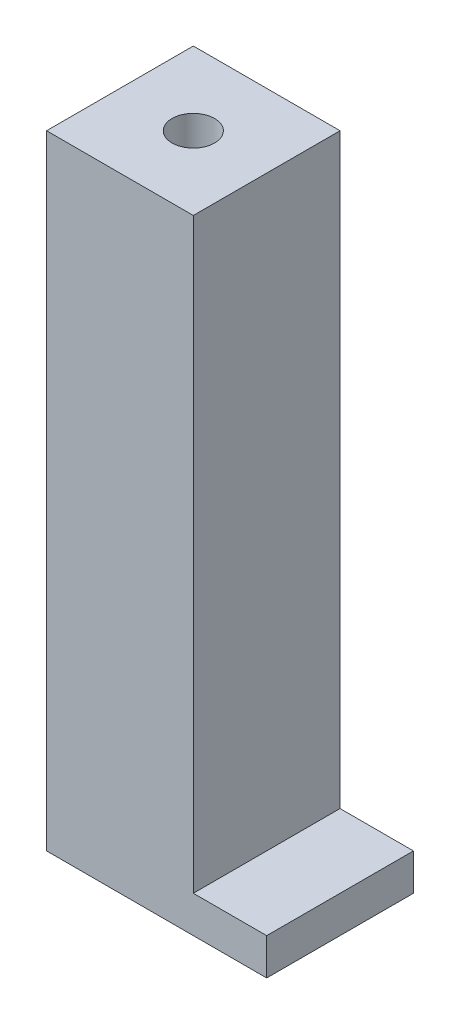
ISO-10303-21;
HEADER;
FILE_DESCRIPTION(('STEP AP214'),'2;1');
FILE_NAME('part.step','',(''),(''),'','','');
FILE_SCHEMA(('AUTOMOTIVE_DESIGN { 1 0 10303 214 1 1 1 1 }'));
ENDSEC;
DATA;
#1=APPLICATION_CONTEXT('core data for automotive mechanical design processes');
#2=APPLICATION_PROTOCOL_DEFINITION('international standard','automotive_design',2000,#1);
#3=PRODUCT_CONTEXT('',#1,'mechanical');
#4=PRODUCT('Part','Part','',(#3));
#5=PRODUCT_RELATED_PRODUCT_CATEGORY('part','',(#4));
#6=PRODUCT_DEFINITION_FORMATION('','',#4);
#7=PRODUCT_DEFINITION_CONTEXT('part definition',#1,'design');
#8=PRODUCT_DEFINITION('design','',#6,#7);
#9=PRODUCT_DEFINITION_SHAPE('','',#8);
#10=(LENGTH_UNIT() NAMED_UNIT(*) SI_UNIT(.MILLI.,.METRE.));
#11=(NAMED_UNIT(*) PLANE_ANGLE_UNIT() SI_UNIT($,.RADIAN.));
#12=(NAMED_UNIT(*) SI_UNIT($,.STERADIAN.) SOLID_ANGLE_UNIT());
#13=UNCERTAINTY_MEASURE_WITH_UNIT(LENGTH_MEASURE(1.E-05),#10,'distance_accuracy_value','');
#14=(GEOMETRIC_REPRESENTATION_CONTEXT(3) GLOBAL_UNCERTAINTY_ASSIGNED_CONTEXT((#13)) GLOBAL_UNIT_ASSIGNED_CONTEXT((#10,
#11,#12)) REPRESENTATION_CONTEXT('',''));
#15=CARTESIAN_POINT('',(0.,0.,0.));
#16=DIRECTION('',(0.,0.,1.));
#17=DIRECTION('',(1.,0.,0.));
#18=AXIS2_PLACEMENT_3D('',#15,#16,#17);
#19=CARTESIAN_POINT('',(10.,80.,-10.));
#20=DIRECTION('',(-1.,0.,0.));
#21=DIRECTION('',(0.,0.,1.));
#22=AXIS2_PLACEMENT_3D('',#19,#20,#21);
#23=PLANE('',#22);
#24=DIRECTION('',(0.,0.,-1.));
#25=VECTOR('',#24,1.);
#26=CARTESIAN_POINT('',(10.,0.,-10.));
#27=LINE('',#26,#25);
#28=CARTESIAN_POINT('',(10.,0.,10.));
#29=VERTEX_POINT('',#28);
#30=CARTESIAN_POINT('',(10.,0.,-10.));
#31=VERTEX_POINT('',#30);
#32=EDGE_CURVE('E139',#29,#31,#27,.T.);
#33=ORIENTED_EDGE('',*,*,#32,.T.);
#34=DIRECTION('',(0.,-1.,0.));
#35=VECTOR('',#34,1.);
#36=CARTESIAN_POINT('',(10.,80.,-10.));
#37=LINE('',#36,#35);
#38=CARTESIAN_POINT('',(10.,80.,-10.));
#39=VERTEX_POINT('',#38);
#40=EDGE_CURVE('E11',#39,#31,#37,.T.);
#41=ORIENTED_EDGE('',*,*,#40,.F.);
#42=DIRECTION('',(0.,0.,-1.));
#43=VECTOR('',#42,1.);
#44=CARTESIAN_POINT('',(10.,80.,-10.));
#45=LINE('',#44,#43);
#46=CARTESIAN_POINT('',(10.,80.,10.));
#47=VERTEX_POINT('',#46);
#48=EDGE_CURVE('E140',#47,#39,#45,.T.);
#49=ORIENTED_EDGE('',*,*,#48,.F.);
#50=DIRECTION('',(0.,-1.,0.));
#51=VECTOR('',#50,1.);
#52=CARTESIAN_POINT('',(10.,80.,10.));
#53=LINE('',#52,#51);
#54=EDGE_CURVE('E150',#47,#29,#53,.T.);
#55=ORIENTED_EDGE('',*,*,#54,.T.);
#56=EDGE_LOOP('',(#33,#41,#49,#55));
#57=FACE_BOUND('',#56,.T.);
#58=ADVANCED_FACE('F39',(#57),#23,.F.);
#59=CARTESIAN_POINT('',(-10.,80.,-10.));
#60=DIRECTION('',(0.,0.,1.));
#61=DIRECTION('',(1.,0.,0.));
#62=AXIS2_PLACEMENT_3D('',#59,#60,#61);
#63=PLANE('',#62);
#64=ORIENTED_EDGE('',*,*,#40,.T.);
#65=DIRECTION('',(1.,0.,0.));
#66=VECTOR('',#65,1.);
#67=CARTESIAN_POINT('',(-10.,0.,-10.));
#68=LINE('',#67,#66);
#69=CARTESIAN_POINT('',(20.,0.,-10.));
#70=VERTEX_POINT('',#69);
#71=EDGE_CURVE('E128',#31,#70,#68,.T.);
#72=ORIENTED_EDGE('',*,*,#71,.T.);
#73=DIRECTION('',(0.,1.,0.));
#74=VECTOR('',#73,1.);
#75=CARTESIAN_POINT('',(20.,-5.,-10.));
#76=LINE('',#75,#74);
#77=CARTESIAN_POINT('',(20.,-5.,-10.));
#78=VERTEX_POINT('',#77);
#79=EDGE_CURVE('E102',#78,#70,#76,.T.);
#80=ORIENTED_EDGE('',*,*,#79,.F.);
#81=DIRECTION('',(1.,0.,0.));
#82=VECTOR('',#81,1.);
#83=CARTESIAN_POINT('',(-10.,-5.,-10.));
#84=LINE('',#83,#82);
#85=CARTESIAN_POINT('',(-10.,-5.,-10.));
#86=VERTEX_POINT('',#85);
#87=EDGE_CURVE('E99',#86,#78,#84,.T.);
#88=ORIENTED_EDGE('',*,*,#87,.F.);
#89=DIRECTION('',(0.,-1.,0.));
#90=VECTOR('',#89,1.);
#91=CARTESIAN_POINT('',(-10.,80.,-10.));
#92=LINE('',#91,#90);
#93=CARTESIAN_POINT('',(-10.,80.,-10.));
#94=VERTEX_POINT('',#93);
#95=EDGE_CURVE('E48',#94,#86,#92,.T.);
#96=ORIENTED_EDGE('',*,*,#95,.F.);
#97=DIRECTION('',(-1.,0.,0.));
#98=VECTOR('',#97,1.);
#99=CARTESIAN_POINT('',(-10.,80.,-10.));
#100=LINE('',#99,#98);
#101=EDGE_CURVE('E143',#39,#94,#100,.T.);
#102=ORIENTED_EDGE('',*,*,#101,.F.);
#103=EDGE_LOOP('',(#64,#72,#80,#88,#96,#102));
#104=FACE_BOUND('',#103,.T.);
#105=ADVANCED_FACE('F100',(#104),#63,.F.);
#106=CARTESIAN_POINT('',(-10.,80.,-10.));
#107=DIRECTION('',(1.,0.,0.));
#108=DIRECTION('',(0.,0.,-1.));
#109=AXIS2_PLACEMENT_3D('',#106,#107,#108);
#110=PLANE('',#109);
#111=ORIENTED_EDGE('',*,*,#95,.T.);
#112=DIRECTION('',(0.,0.,-1.));
#113=VECTOR('',#112,1.);
#114=CARTESIAN_POINT('',(-10.,-5.,10.));
#115=LINE('',#114,#113);
#116=CARTESIAN_POINT('',(-10.,-5.,10.));
#117=VERTEX_POINT('',#116);
#118=EDGE_CURVE('E93',#117,#86,#115,.T.);
#119=ORIENTED_EDGE('',*,*,#118,.F.);
#120=DIRECTION('',(0.,-1.,0.));
#121=VECTOR('',#120,1.);
#122=CARTESIAN_POINT('',(-10.,80.,10.));
#123=LINE('',#122,#121);
#124=CARTESIAN_POINT('',(-10.,80.,10.));
#125=VERTEX_POINT('',#124);
#126=EDGE_CURVE('E97',#125,#117,#123,.T.);
#127=ORIENTED_EDGE('',*,*,#126,.F.);
#128=DIRECTION('',(0.,0.,1.));
#129=VECTOR('',#128,1.);
#130=CARTESIAN_POINT('',(-10.,80.,-10.));
#131=LINE('',#130,#129);
#132=EDGE_CURVE('E94',#94,#125,#131,.T.);
#133=ORIENTED_EDGE('',*,*,#132,.F.);
#134=EDGE_LOOP('',(#111,#119,#127,#133));
#135=FACE_BOUND('',#134,.T.);
#136=ADVANCED_FACE('F90',(#135),#110,.F.);
#137=CARTESIAN_POINT('',(-10.,80.,10.));
#138=DIRECTION('',(0.,0.,-1.));
#139=DIRECTION('',(-1.,0.,0.));
#140=AXIS2_PLACEMENT_3D('',#137,#138,#139);
#141=PLANE('',#140);
#142=ORIENTED_EDGE('',*,*,#126,.T.);
#143=DIRECTION('',(-1.,0.,0.));
#144=VECTOR('',#143,1.);
#145=CARTESIAN_POINT('',(-10.,-5.,10.));
#146=LINE('',#145,#144);
#147=CARTESIAN_POINT('',(20.,-5.,10.));
#148=VERTEX_POINT('',#147);
#149=EDGE_CURVE('E111',#148,#117,#146,.T.);
#150=ORIENTED_EDGE('',*,*,#149,.F.);
#151=DIRECTION('',(0.,1.,0.));
#152=VECTOR('',#151,1.);
#153=CARTESIAN_POINT('',(20.,-5.,10.));
#154=LINE('',#153,#152);
#155=CARTESIAN_POINT('',(20.,0.,10.));
#156=VERTEX_POINT('',#155);
#157=EDGE_CURVE('E127',#148,#156,#154,.T.);
#158=ORIENTED_EDGE('',*,*,#157,.T.);
#159=DIRECTION('',(-1.,0.,0.));
#160=VECTOR('',#159,1.);
#161=CARTESIAN_POINT('',(-10.,0.,10.));
#162=LINE('',#161,#160);
#163=EDGE_CURVE('E113',#156,#29,#162,.T.);
#164=ORIENTED_EDGE('',*,*,#163,.T.);
#165=ORIENTED_EDGE('',*,*,#54,.F.);
#166=DIRECTION('',(1.,0.,0.));
#167=VECTOR('',#166,1.);
#168=CARTESIAN_POINT('',(-10.,80.,10.));
#169=LINE('',#168,#167);
#170=EDGE_CURVE('E55',#125,#47,#169,.T.);
#171=ORIENTED_EDGE('',*,*,#170,.F.);
#172=EDGE_LOOP('',(#142,#150,#158,#164,#165,#171));
#173=FACE_BOUND('',#172,.T.);
#174=ADVANCED_FACE('F159',(#173),#141,.F.);
#175=CARTESIAN_POINT('',(0.,80.,0.));
#176=DIRECTION('',(0.,1.,0.));
#177=DIRECTION('',(0.,0.,1.));
#178=AXIS2_PLACEMENT_3D('',#175,#176,#177);
#179=PLANE('',#178);
#180=CARTESIAN_POINT('',(0.,80.,0.));
#181=DIRECTION('',(0.,1.,0.));
#182=DIRECTION('',(0.,0.,1.));
#183=AXIS2_PLACEMENT_3D('',#180,#181,#182);
#184=CIRCLE('',#183,2.9);
#185=CARTESIAN_POINT('',(0.,80.,2.9));
#186=VERTEX_POINT('',#185);
#187=EDGE_CURVE('E120',#186,#186,#184,.T.);
#188=ORIENTED_EDGE('',*,*,#187,.F.);
#189=EDGE_LOOP('',(#188));
#190=FACE_BOUND('',#189,.T.);
#191=ORIENTED_EDGE('',*,*,#48,.T.);
#192=ORIENTED_EDGE('',*,*,#101,.T.);
#193=ORIENTED_EDGE('',*,*,#132,.T.);
#194=ORIENTED_EDGE('',*,*,#170,.T.);
#195=EDGE_LOOP('',(#191,#192,#193,#194));
#196=FACE_BOUND('',#195,.T.);
#197=ADVANCED_FACE('F164',(#190,#196),#179,.T.);
#198=CARTESIAN_POINT('',(20.,-5.,10.));
#199=DIRECTION('',(-1.,0.,0.));
#200=DIRECTION('',(0.,0.,1.));
#201=AXIS2_PLACEMENT_3D('',#198,#199,#200);
#202=PLANE('',#201);
#203=DIRECTION('',(0.,0.,1.));
#204=VECTOR('',#203,1.);
#205=CARTESIAN_POINT('',(20.,0.,10.));
#206=LINE('',#205,#204);
#207=EDGE_CURVE('E117',#70,#156,#206,.T.);
#208=ORIENTED_EDGE('',*,*,#207,.T.);
#209=ORIENTED_EDGE('',*,*,#157,.F.);
#210=DIRECTION('',(0.,0.,1.));
#211=VECTOR('',#210,1.);
#212=CARTESIAN_POINT('',(20.,-5.,10.));
#213=LINE('',#212,#211);
#214=EDGE_CURVE('E106',#78,#148,#213,.T.);
#215=ORIENTED_EDGE('',*,*,#214,.F.);
#216=ORIENTED_EDGE('',*,*,#79,.T.);
#217=EDGE_LOOP('',(#208,#209,#215,#216));
#218=FACE_BOUND('',#217,.T.);
#219=ADVANCED_FACE('F171',(#218),#202,.F.);
#220=CARTESIAN_POINT('',(0.,-5.,0.));
#221=DIRECTION('',(0.,-1.,0.));
#222=DIRECTION('',(0.,0.,-1.));
#223=AXIS2_PLACEMENT_3D('',#220,#221,#222);
#224=PLANE('',#223);
#225=ORIENTED_EDGE('',*,*,#118,.T.);
#226=ORIENTED_EDGE('',*,*,#87,.T.);
#227=ORIENTED_EDGE('',*,*,#214,.T.);
#228=ORIENTED_EDGE('',*,*,#149,.T.);
#229=EDGE_LOOP('',(#225,#226,#227,#228));
#230=FACE_BOUND('',#229,.T.);
#231=ADVANCED_FACE('F109',(#230),#224,.T.);
#232=CARTESIAN_POINT('',(0.,0.,0.));
#233=DIRECTION('',(0.,-1.,0.));
#234=DIRECTION('',(0.,0.,-1.));
#235=AXIS2_PLACEMENT_3D('',#232,#233,#234);
#236=PLANE('',#235);
#237=ORIENTED_EDGE('',*,*,#32,.F.);
#238=ORIENTED_EDGE('',*,*,#163,.F.);
#239=ORIENTED_EDGE('',*,*,#207,.F.);
#240=ORIENTED_EDGE('',*,*,#71,.F.);
#241=EDGE_LOOP('',(#237,#238,#239,#240));
#242=FACE_BOUND('',#241,.T.);
#243=ADVANCED_FACE('F167',(#242),#236,.F.);
#244=CARTESIAN_POINT('',(0.,70.,0.));
#245=DIRECTION('',(0.,1.,0.));
#246=DIRECTION('',(0.,0.,1.));
#247=AXIS2_PLACEMENT_3D('',#244,#245,#246);
#248=CYLINDRICAL_SURFACE('',#247,2.9);
#249=CARTESIAN_POINT('',(0.,70.,0.));
#250=DIRECTION('',(0.,1.,0.));
#251=DIRECTION('',(0.,0.,1.));
#252=AXIS2_PLACEMENT_3D('',#249,#250,#251);
#253=CIRCLE('',#252,2.9);
#254=CARTESIAN_POINT('',(0.,70.,2.9));
#255=VERTEX_POINT('',#254);
#256=EDGE_CURVE('E131',#255,#255,#253,.T.);
#257=ORIENTED_EDGE('',*,*,#256,.F.);
#258=EDGE_LOOP('',(#257));
#259=FACE_BOUND('',#258,.T.);
#260=ORIENTED_EDGE('',*,*,#187,.T.);
#261=EDGE_LOOP('',(#260));
#262=FACE_BOUND('',#261,.T.);
#263=ADVANCED_FACE('F212',(#259,#262),#248,.F.);
#264=CARTESIAN_POINT('',(0.,70.,0.));
#265=DIRECTION('',(0.,1.,0.));
#266=DIRECTION('',(0.,0.,1.));
#267=AXIS2_PLACEMENT_3D('',#264,#265,#266);
#268=PLANE('',#267);
#269=ORIENTED_EDGE('',*,*,#256,.T.);
#270=EDGE_LOOP('',(#269));
#271=FACE_BOUND('',#270,.T.);
#272=ADVANCED_FACE('F217',(#271),#268,.T.);
#273=CLOSED_SHELL('',(#58,#105,#136,#174,#197,#219,#231,#243,#263,#272));
#274=MANIFOLD_SOLID_BREP('B2',#273);
#275=ADVANCED_BREP_SHAPE_REPRESENTATION('',(#18,#274),#14);
#276=SHAPE_DEFINITION_REPRESENTATION(#9,#275);
ENDSEC;
END-ISO-10303-21;
